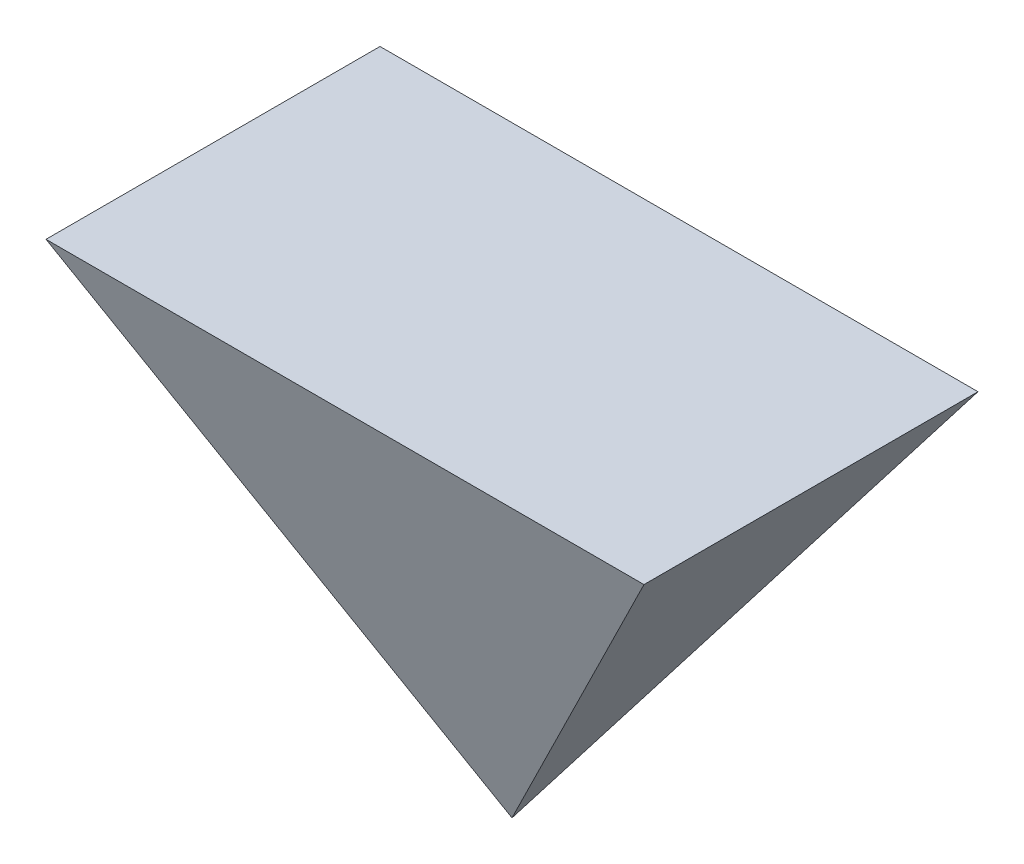
ISO-10303-21;
HEADER;
FILE_DESCRIPTION(('STEP AP214'),'2;1');
FILE_NAME('part.step','',(''),(''),'','','');
FILE_SCHEMA(('AUTOMOTIVE_DESIGN { 1 0 10303 214 1 1 1 1 }'));
ENDSEC;
DATA;
#1=APPLICATION_CONTEXT('core data for automotive mechanical design processes');
#2=APPLICATION_PROTOCOL_DEFINITION('international standard','automotive_design',2000,#1);
#3=PRODUCT_CONTEXT('',#1,'mechanical');
#4=PRODUCT('Part','Part','',(#3));
#5=PRODUCT_RELATED_PRODUCT_CATEGORY('part','',(#4));
#6=PRODUCT_DEFINITION_FORMATION('','',#4);
#7=PRODUCT_DEFINITION_CONTEXT('part definition',#1,'design');
#8=PRODUCT_DEFINITION('design','',#6,#7);
#9=PRODUCT_DEFINITION_SHAPE('','',#8);
#10=(LENGTH_UNIT() NAMED_UNIT(*) SI_UNIT(.MILLI.,.METRE.));
#11=(NAMED_UNIT(*) PLANE_ANGLE_UNIT() SI_UNIT($,.RADIAN.));
#12=(NAMED_UNIT(*) SI_UNIT($,.STERADIAN.) SOLID_ANGLE_UNIT());
#13=UNCERTAINTY_MEASURE_WITH_UNIT(LENGTH_MEASURE(1.E-05),#10,'distance_accuracy_value','');
#14=(GEOMETRIC_REPRESENTATION_CONTEXT(3) GLOBAL_UNCERTAINTY_ASSIGNED_CONTEXT((#13)) GLOBAL_UNIT_ASSIGNED_CONTEXT((#10,
#11,#12)) REPRESENTATION_CONTEXT('',''));
#15=CARTESIAN_POINT('',(0.,0.,0.));
#16=DIRECTION('',(0.,0.,1.));
#17=DIRECTION('',(1.,0.,0.));
#18=AXIS2_PLACEMENT_3D('',#15,#16,#17);
#19=CARTESIAN_POINT('',(0.,1500.,0.));
#20=DIRECTION('',(0.,1.,0.));
#21=DIRECTION('',(0.,0.,1.));
#22=AXIS2_PLACEMENT_3D('',#19,#20,#21);
#23=PLANE('',#22);
#24=DIRECTION('',(0.,0.,-1.));
#25=VECTOR('',#24,1.);
#26=CARTESIAN_POINT('',(1032.285838,1500.,-576.5709526));
#27=LINE('',#26,#25);
#28=CARTESIAN_POINT('',(1032.285838,1500.,576.5709526));
#29=VERTEX_POINT('',#28);
#30=CARTESIAN_POINT('',(1032.285838,1500.,-576.5709526));
#31=VERTEX_POINT('',#30);
#32=EDGE_CURVE('E176',#29,#31,#27,.T.);
#33=ORIENTED_EDGE('',*,*,#32,.T.);
#34=DIRECTION('',(-1.,0.,0.));
#35=VECTOR('',#34,1.);
#36=CARTESIAN_POINT('',(-1032.285838,1500.,-576.5709526));
#37=LINE('',#36,#35);
#38=CARTESIAN_POINT('',(-1032.285838,1500.,-576.5709526));
#39=VERTEX_POINT('',#38);
#40=EDGE_CURVE('E12',#31,#39,#37,.T.);
#41=ORIENTED_EDGE('',*,*,#40,.T.);
#42=DIRECTION('',(0.,0.,1.));
#43=VECTOR('',#42,1.);
#44=CARTESIAN_POINT('',(-1032.285838,1500.,-576.5709526));
#45=LINE('',#44,#43);
#46=CARTESIAN_POINT('',(-1032.285838,1500.,576.5709526));
#47=VERTEX_POINT('',#46);
#48=EDGE_CURVE('E65',#39,#47,#45,.T.);
#49=ORIENTED_EDGE('',*,*,#48,.T.);
#50=DIRECTION('',(1.,0.,0.));
#51=VECTOR('',#50,1.);
#52=CARTESIAN_POINT('',(-1032.285838,1500.,576.5709526));
#53=LINE('',#52,#51);
#54=EDGE_CURVE('E196',#47,#29,#53,.T.);
#55=ORIENTED_EDGE('',*,*,#54,.T.);
#56=EDGE_LOOP('',(#33,#41,#49,#55));
#57=FACE_BOUND('',#56,.T.);
#58=ADVANCED_FACE('F54',(#57),#23,.T.);
#59=CARTESIAN_POINT('',(0.,0.,0.));
#60=DIRECTION('',(0.,1.,0.));
#61=DIRECTION('',(0.,0.,1.));
#62=AXIS2_PLACEMENT_3D('',#59,#60,#61);
#63=PLANE('',#62);
#64=DIRECTION('',(0.,0.,-1.));
#65=VECTOR('',#64,1.);
#66=CARTESIAN_POINT('',(1.3644,0.,-0.7749));
#67=LINE('',#66,#65);
#68=CARTESIAN_POINT('',(1.3644,0.,0.7749));
#69=VERTEX_POINT('',#68);
#70=CARTESIAN_POINT('',(1.3644,0.,-0.7749));
#71=VERTEX_POINT('',#70);
#72=EDGE_CURVE('E164',#69,#71,#67,.T.);
#73=ORIENTED_EDGE('',*,*,#72,.F.);
#74=DIRECTION('',(1.,0.,0.));
#75=VECTOR('',#74,1.);
#76=CARTESIAN_POINT('',(-1.3644,0.,0.7749));
#77=LINE('',#76,#75);
#78=CARTESIAN_POINT('',(-1.3644,0.,0.7749));
#79=VERTEX_POINT('',#78);
#80=EDGE_CURVE('E123',#79,#69,#77,.T.);
#81=ORIENTED_EDGE('',*,*,#80,.F.);
#82=DIRECTION('',(0.,0.,1.));
#83=VECTOR('',#82,1.);
#84=CARTESIAN_POINT('',(-1.3644,0.,-0.7749));
#85=LINE('',#84,#83);
#86=CARTESIAN_POINT('',(-1.3644,0.,-0.7749));
#87=VERTEX_POINT('',#86);
#88=EDGE_CURVE('E104',#87,#79,#85,.T.);
#89=ORIENTED_EDGE('',*,*,#88,.F.);
#90=DIRECTION('',(-1.,0.,0.));
#91=VECTOR('',#90,1.);
#92=CARTESIAN_POINT('',(-1.3644,0.,-0.7749));
#93=LINE('',#92,#91);
#94=EDGE_CURVE('E110',#71,#87,#93,.T.);
#95=ORIENTED_EDGE('',*,*,#94,.F.);
#96=EDGE_LOOP('',(#73,#81,#89,#95));
#97=FACE_BOUND('',#96,.T.);
#98=ADVANCED_FACE('F122',(#97),#63,.F.);
#99=CARTESIAN_POINT('',(0.,-0.259254653449425,-0.675381462617094));
#100=DIRECTION('',(0.,-0.358367949570729,-0.933580426487441));
#101=DIRECTION('',(0.,0.933580426487441,-0.358367949570729));
#102=AXIS2_PLACEMENT_3D('',#99,#100,#101);
#103=PLANE('',#102);
#104=DIRECTION('',(-0.540027804084052,0.785745330602077,-0.301619373139705));
#105=VECTOR('',#104,1.);
#106=CARTESIAN_POINT('',(-1.3644,0.,-0.7749));
#107=LINE('',#106,#105);
#108=EDGE_CURVE('E99',#87,#39,#107,.T.);
#109=ORIENTED_EDGE('',*,*,#108,.T.);
#110=ORIENTED_EDGE('',*,*,#40,.F.);
#111=DIRECTION('',(0.540027804084052,0.785745330602077,-0.301619373139705));
#112=VECTOR('',#111,1.);
#113=CARTESIAN_POINT('',(1.3644,0.,-0.7749));
#114=LINE('',#113,#112);
#115=EDGE_CURVE('E73',#71,#31,#114,.T.);
#116=ORIENTED_EDGE('',*,*,#115,.F.);
#117=ORIENTED_EDGE('',*,*,#94,.T.);
#118=EDGE_LOOP('',(#109,#110,#116,#117));
#119=FACE_BOUND('',#118,.T.);
#120=ADVANCED_FACE('F113',(#119),#103,.T.);
#121=CARTESIAN_POINT('',(0.926678615123559,-0.636888566978019,0.));
#122=DIRECTION('',(-0.82412618859699,0.566406236961245,0.));
#123=DIRECTION('',(-0.566406236961245,-0.82412618859699,0.));
#124=AXIS2_PLACEMENT_3D('',#121,#122,#123);
#125=PLANE('',#124);
#126=ORIENTED_EDGE('',*,*,#115,.T.);
#127=ORIENTED_EDGE('',*,*,#32,.F.);
#128=DIRECTION('',(0.540027804084052,0.785745330602077,0.301619373139705));
#129=VECTOR('',#128,1.);
#130=CARTESIAN_POINT('',(1.3644,0.,0.7749));
#131=LINE('',#130,#129);
#132=EDGE_CURVE('E205',#69,#29,#131,.T.);
#133=ORIENTED_EDGE('',*,*,#132,.F.);
#134=ORIENTED_EDGE('',*,*,#72,.T.);
#135=EDGE_LOOP('',(#126,#127,#133,#134));
#136=FACE_BOUND('',#135,.T.);
#137=ADVANCED_FACE('F224',(#136),#125,.F.);
#138=CARTESIAN_POINT('',(-0.926678615123527,-0.636888566977997,0.));
#139=DIRECTION('',(0.82412618859699,0.566406236961245,0.));
#140=DIRECTION('',(-0.566406236961245,0.82412618859699,0.));
#141=AXIS2_PLACEMENT_3D('',#138,#139,#140);
#142=PLANE('',#141);
#143=DIRECTION('',(-0.540027804084052,0.785745330602077,0.301619373139705));
#144=VECTOR('',#143,1.);
#145=CARTESIAN_POINT('',(-1.3644,0.,0.7749));
#146=LINE('',#145,#144);
#147=EDGE_CURVE('E207',#79,#47,#146,.T.);
#148=ORIENTED_EDGE('',*,*,#147,.T.);
#149=ORIENTED_EDGE('',*,*,#48,.F.);
#150=ORIENTED_EDGE('',*,*,#108,.F.);
#151=ORIENTED_EDGE('',*,*,#88,.T.);
#152=EDGE_LOOP('',(#148,#149,#150,#151));
#153=FACE_BOUND('',#152,.T.);
#154=ADVANCED_FACE('F102',(#153),#142,.F.);
#155=CARTESIAN_POINT('',(0.,-0.259254653449425,0.675381462617094));
#156=DIRECTION('',(0.,-0.358367949570729,0.933580426487441));
#157=DIRECTION('',(0.,-0.933580426487441,-0.358367949570729));
#158=AXIS2_PLACEMENT_3D('',#155,#156,#157);
#159=PLANE('',#158);
#160=ORIENTED_EDGE('',*,*,#132,.T.);
#161=ORIENTED_EDGE('',*,*,#54,.F.);
#162=ORIENTED_EDGE('',*,*,#147,.F.);
#163=ORIENTED_EDGE('',*,*,#80,.T.);
#164=EDGE_LOOP('',(#160,#161,#162,#163));
#165=FACE_BOUND('',#164,.T.);
#166=ADVANCED_FACE('F250',(#165),#159,.T.);
#167=CLOSED_SHELL('',(#58,#98,#120,#137,#154,#166));
#168=MANIFOLD_SOLID_BREP('B2',#167);
#169=ADVANCED_BREP_SHAPE_REPRESENTATION('',(#18,#168),#14);
#170=SHAPE_DEFINITION_REPRESENTATION(#9,#169);
ENDSEC;
END-ISO-10303-21;
